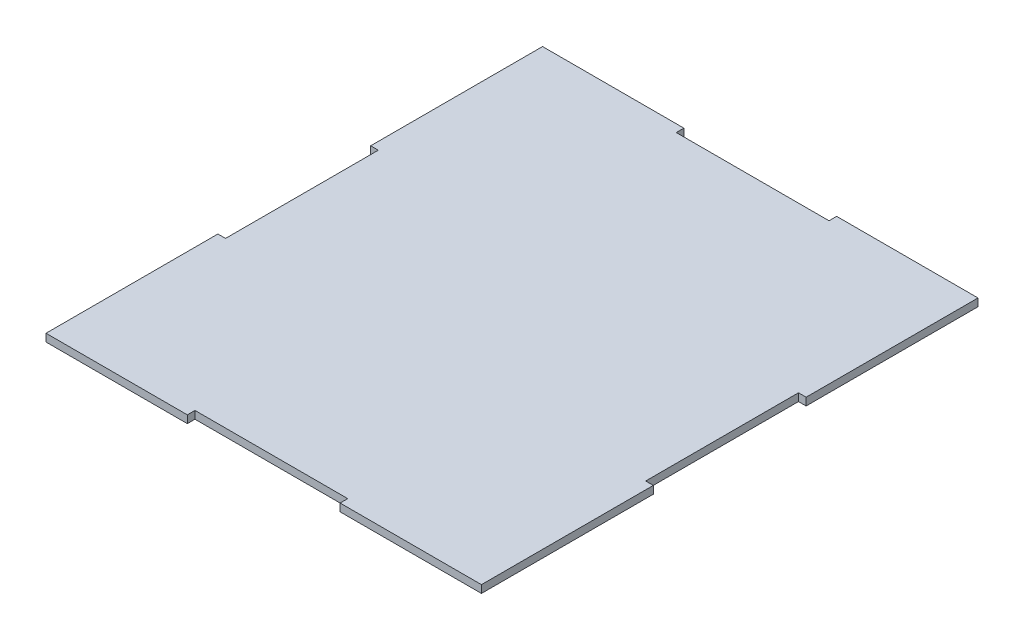
ISO-10303-21;
HEADER;
FILE_DESCRIPTION(('STEP AP214'),'2;1');
FILE_NAME('part.step','',(''),(''),'','','');
FILE_SCHEMA(('AUTOMOTIVE_DESIGN { 1 0 10303 214 1 1 1 1 }'));
ENDSEC;
DATA;
#1=APPLICATION_CONTEXT('core data for automotive mechanical design processes');
#2=APPLICATION_PROTOCOL_DEFINITION('international standard','automotive_design',2000,#1);
#3=PRODUCT_CONTEXT('',#1,'mechanical');
#4=PRODUCT('Part','Part','',(#3));
#5=PRODUCT_RELATED_PRODUCT_CATEGORY('part','',(#4));
#6=PRODUCT_DEFINITION_FORMATION('','',#4);
#7=PRODUCT_DEFINITION_CONTEXT('part definition',#1,'design');
#8=PRODUCT_DEFINITION('design','',#6,#7);
#9=PRODUCT_DEFINITION_SHAPE('','',#8);
#10=(LENGTH_UNIT() NAMED_UNIT(*) SI_UNIT(.MILLI.,.METRE.));
#11=(NAMED_UNIT(*) PLANE_ANGLE_UNIT() SI_UNIT($,.RADIAN.));
#12=(NAMED_UNIT(*) SI_UNIT($,.STERADIAN.) SOLID_ANGLE_UNIT());
#13=UNCERTAINTY_MEASURE_WITH_UNIT(LENGTH_MEASURE(1.E-05),#10,'distance_accuracy_value','');
#14=(GEOMETRIC_REPRESENTATION_CONTEXT(3) GLOBAL_UNCERTAINTY_ASSIGNED_CONTEXT((#13)) GLOBAL_UNIT_ASSIGNED_CONTEXT((#10,
#11,#12)) REPRESENTATION_CONTEXT('',''));
#15=CARTESIAN_POINT('',(0.,0.,0.));
#16=DIRECTION('',(0.,0.,1.));
#17=DIRECTION('',(1.,0.,0.));
#18=AXIS2_PLACEMENT_3D('',#15,#16,#17);
#19=CARTESIAN_POINT('',(0.,5.,0.));
#20=DIRECTION('',(1.,0.,0.));
#21=DIRECTION('',(0.,0.,-1.));
#22=AXIS2_PLACEMENT_3D('',#19,#20,#21);
#23=PLANE('',#22);
#24=DIRECTION('',(0.,0.,1.));
#25=VECTOR('',#24,1.);
#26=CARTESIAN_POINT('',(0.,0.,0.));
#27=LINE('',#26,#25);
#28=CARTESIAN_POINT('',(0.,0.,-325.));
#29=VERTEX_POINT('',#28);
#30=CARTESIAN_POINT('',(0.,0.,-212.5));
#31=VERTEX_POINT('',#30);
#32=EDGE_CURVE('E299',#29,#31,#27,.T.);
#33=ORIENTED_EDGE('',*,*,#32,.T.);
#34=DIRECTION('',(0.,1.,0.));
#35=VECTOR('',#34,1.);
#36=CARTESIAN_POINT('',(0.,0.,-212.5));
#37=LINE('',#36,#35);
#38=CARTESIAN_POINT('',(0.,5.,-212.5));
#39=VERTEX_POINT('',#38);
#40=EDGE_CURVE('E215',#31,#39,#37,.T.);
#41=ORIENTED_EDGE('',*,*,#40,.T.);
#42=DIRECTION('',(0.,0.,1.));
#43=VECTOR('',#42,1.);
#44=CARTESIAN_POINT('',(0.,5.,0.));
#45=LINE('',#44,#43);
#46=CARTESIAN_POINT('',(0.,5.,-325.));
#47=VERTEX_POINT('',#46);
#48=EDGE_CURVE('E282',#47,#39,#45,.T.);
#49=ORIENTED_EDGE('',*,*,#48,.F.);
#50=DIRECTION('',(0.,-1.,0.));
#51=VECTOR('',#50,1.);
#52=CARTESIAN_POINT('',(0.,5.,-325.));
#53=LINE('',#52,#51);
#54=EDGE_CURVE('E298',#47,#29,#53,.T.);
#55=ORIENTED_EDGE('',*,*,#54,.T.);
#56=EDGE_LOOP('',(#33,#41,#49,#55));
#57=FACE_BOUND('',#56,.T.);
#58=ADVANCED_FACE('F33',(#57),#23,.F.);
#59=CARTESIAN_POINT('',(0.,5.,0.));
#60=DIRECTION('',(0.,0.,-1.));
#61=DIRECTION('',(-1.,0.,0.));
#62=AXIS2_PLACEMENT_3D('',#59,#60,#61);
#63=PLANE('',#62);
#64=DIRECTION('',(1.,0.,0.));
#65=VECTOR('',#64,1.);
#66=CARTESIAN_POINT('',(0.,0.,0.));
#67=LINE('',#66,#65);
#68=CARTESIAN_POINT('',(0.,0.,0.));
#69=VERTEX_POINT('',#68);
#70=CARTESIAN_POINT('',(92.5,0.,0.));
#71=VERTEX_POINT('',#70);
#72=EDGE_CURVE('E303',#69,#71,#67,.T.);
#73=ORIENTED_EDGE('',*,*,#72,.T.);
#74=DIRECTION('',(0.,1.,0.));
#75=VECTOR('',#74,1.);
#76=CARTESIAN_POINT('',(92.5,0.,0.));
#77=LINE('',#76,#75);
#78=CARTESIAN_POINT('',(92.5,5.,0.));
#79=VERTEX_POINT('',#78);
#80=EDGE_CURVE('E246',#71,#79,#77,.T.);
#81=ORIENTED_EDGE('',*,*,#80,.T.);
#82=DIRECTION('',(1.,0.,0.));
#83=VECTOR('',#82,1.);
#84=CARTESIAN_POINT('',(0.,5.,0.));
#85=LINE('',#84,#83);
#86=CARTESIAN_POINT('',(0.,5.,0.));
#87=VERTEX_POINT('',#86);
#88=EDGE_CURVE('E287',#87,#79,#85,.T.);
#89=ORIENTED_EDGE('',*,*,#88,.F.);
#90=DIRECTION('',(0.,-1.,0.));
#91=VECTOR('',#90,1.);
#92=CARTESIAN_POINT('',(0.,5.,0.));
#93=LINE('',#92,#91);
#94=EDGE_CURVE('E11',#87,#69,#93,.T.);
#95=ORIENTED_EDGE('',*,*,#94,.T.);
#96=EDGE_LOOP('',(#73,#81,#89,#95));
#97=FACE_BOUND('',#96,.T.);
#98=ADVANCED_FACE('F349',(#97),#63,.F.);
#99=CARTESIAN_POINT('',(285.,5.,0.));
#100=DIRECTION('',(-1.,0.,0.));
#101=DIRECTION('',(0.,0.,1.));
#102=AXIS2_PLACEMENT_3D('',#99,#100,#101);
#103=PLANE('',#102);
#104=DIRECTION('',(0.,0.,-1.));
#105=VECTOR('',#104,1.);
#106=CARTESIAN_POINT('',(285.,0.,0.));
#107=LINE('',#106,#105);
#108=CARTESIAN_POINT('',(285.,0.,0.));
#109=VERTEX_POINT('',#108);
#110=CARTESIAN_POINT('',(285.,0.,-112.5));
#111=VERTEX_POINT('',#110);
#112=EDGE_CURVE('E307',#109,#111,#107,.T.);
#113=ORIENTED_EDGE('',*,*,#112,.T.);
#114=DIRECTION('',(0.,1.,0.));
#115=VECTOR('',#114,1.);
#116=CARTESIAN_POINT('',(285.,0.,-112.5));
#117=LINE('',#116,#115);
#118=CARTESIAN_POINT('',(285.,5.,-112.5));
#119=VERTEX_POINT('',#118);
#120=EDGE_CURVE('E219',#111,#119,#117,.T.);
#121=ORIENTED_EDGE('',*,*,#120,.T.);
#122=DIRECTION('',(0.,0.,-1.));
#123=VECTOR('',#122,1.);
#124=CARTESIAN_POINT('',(285.,5.,0.));
#125=LINE('',#124,#123);
#126=CARTESIAN_POINT('',(285.,5.,0.));
#127=VERTEX_POINT('',#126);
#128=EDGE_CURVE('E291',#127,#119,#125,.T.);
#129=ORIENTED_EDGE('',*,*,#128,.F.);
#130=DIRECTION('',(0.,-1.,0.));
#131=VECTOR('',#130,1.);
#132=CARTESIAN_POINT('',(285.,5.,0.));
#133=LINE('',#132,#131);
#134=EDGE_CURVE('E41',#127,#109,#133,.T.);
#135=ORIENTED_EDGE('',*,*,#134,.T.);
#136=EDGE_LOOP('',(#113,#121,#129,#135));
#137=FACE_BOUND('',#136,.T.);
#138=ADVANCED_FACE('F322',(#137),#103,.F.);
#139=CARTESIAN_POINT('',(0.,5.,-325.));
#140=DIRECTION('',(0.,0.,1.));
#141=DIRECTION('',(1.,0.,0.));
#142=AXIS2_PLACEMENT_3D('',#139,#140,#141);
#143=PLANE('',#142);
#144=DIRECTION('',(-1.,0.,0.));
#145=VECTOR('',#144,1.);
#146=CARTESIAN_POINT('',(0.,5.,-325.));
#147=LINE('',#146,#145);
#148=CARTESIAN_POINT('',(92.5,5.,-325.));
#149=VERTEX_POINT('',#148);
#150=EDGE_CURVE('E294',#149,#47,#147,.T.);
#151=ORIENTED_EDGE('',*,*,#150,.F.);
#152=DIRECTION('',(0.,1.,0.));
#153=VECTOR('',#152,1.);
#154=CARTESIAN_POINT('',(92.5,0.,-325.));
#155=LINE('',#154,#153);
#156=CARTESIAN_POINT('',(92.5,0.,-325.));
#157=VERTEX_POINT('',#156);
#158=EDGE_CURVE('E200',#157,#149,#155,.T.);
#159=ORIENTED_EDGE('',*,*,#158,.F.);
#160=DIRECTION('',(-1.,0.,0.));
#161=VECTOR('',#160,1.);
#162=CARTESIAN_POINT('',(0.,0.,-325.));
#163=LINE('',#162,#161);
#164=EDGE_CURVE('E190',#157,#29,#163,.T.);
#165=ORIENTED_EDGE('',*,*,#164,.T.);
#166=ORIENTED_EDGE('',*,*,#54,.F.);
#167=EDGE_LOOP('',(#151,#159,#165,#166));
#168=FACE_BOUND('',#167,.T.);
#169=ADVANCED_FACE('F369',(#168),#143,.F.);
#170=CARTESIAN_POINT('',(0.,5.,-112.5));
#171=VERTEX_POINT('',#170);
#172=EDGE_CURVE('E286',#171,#87,#45,.T.);
#173=ORIENTED_EDGE('',*,*,#172,.F.);
#174=DIRECTION('',(0.,1.,0.));
#175=VECTOR('',#174,1.);
#176=CARTESIAN_POINT('',(0.,0.,-112.5));
#177=LINE('',#176,#175);
#178=CARTESIAN_POINT('',(0.,0.,-112.5));
#179=VERTEX_POINT('',#178);
#180=EDGE_CURVE('E227',#179,#171,#177,.T.);
#181=ORIENTED_EDGE('',*,*,#180,.F.);
#182=EDGE_CURVE('E202',#179,#69,#27,.T.);
#183=ORIENTED_EDGE('',*,*,#182,.T.);
#184=ORIENTED_EDGE('',*,*,#94,.F.);
#185=EDGE_LOOP('',(#173,#181,#183,#184));
#186=FACE_BOUND('',#185,.T.);
#187=ADVANCED_FACE('F35',(#186),#23,.F.);
#188=CARTESIAN_POINT('',(192.5,5.,0.));
#189=VERTEX_POINT('',#188);
#190=EDGE_CURVE('E285',#189,#127,#85,.T.);
#191=ORIENTED_EDGE('',*,*,#190,.F.);
#192=DIRECTION('',(0.,1.,0.));
#193=VECTOR('',#192,1.);
#194=CARTESIAN_POINT('',(192.5,0.,0.));
#195=LINE('',#194,#193);
#196=CARTESIAN_POINT('',(192.5,0.,0.));
#197=VERTEX_POINT('',#196);
#198=EDGE_CURVE('E267',#197,#189,#195,.T.);
#199=ORIENTED_EDGE('',*,*,#198,.F.);
#200=EDGE_CURVE('E302',#197,#109,#67,.T.);
#201=ORIENTED_EDGE('',*,*,#200,.T.);
#202=ORIENTED_EDGE('',*,*,#134,.F.);
#203=EDGE_LOOP('',(#191,#199,#201,#202));
#204=FACE_BOUND('',#203,.T.);
#205=ADVANCED_FACE('F336',(#204),#63,.F.);
#206=CARTESIAN_POINT('',(285.,5.,-212.5));
#207=VERTEX_POINT('',#206);
#208=CARTESIAN_POINT('',(285.,5.,-325.));
#209=VERTEX_POINT('',#208);
#210=EDGE_CURVE('E290',#207,#209,#125,.T.);
#211=ORIENTED_EDGE('',*,*,#210,.F.);
#212=DIRECTION('',(0.,1.,0.));
#213=VECTOR('',#212,1.);
#214=CARTESIAN_POINT('',(285.,0.,-212.5));
#215=LINE('',#214,#213);
#216=CARTESIAN_POINT('',(285.,0.,-212.5));
#217=VERTEX_POINT('',#216);
#218=EDGE_CURVE('E241',#217,#207,#215,.T.);
#219=ORIENTED_EDGE('',*,*,#218,.F.);
#220=CARTESIAN_POINT('',(285.,0.,-325.));
#221=VERTEX_POINT('',#220);
#222=EDGE_CURVE('E306',#217,#221,#107,.T.);
#223=ORIENTED_EDGE('',*,*,#222,.T.);
#224=DIRECTION('',(0.,-1.,0.));
#225=VECTOR('',#224,1.);
#226=CARTESIAN_POINT('',(285.,5.,-325.));
#227=LINE('',#226,#225);
#228=EDGE_CURVE('E315',#209,#221,#227,.T.);
#229=ORIENTED_EDGE('',*,*,#228,.F.);
#230=EDGE_LOOP('',(#211,#219,#223,#229));
#231=FACE_BOUND('',#230,.T.);
#232=ADVANCED_FACE('F381',(#231),#103,.F.);
#233=CARTESIAN_POINT('',(192.5,0.,-325.));
#234=VERTEX_POINT('',#233);
#235=EDGE_CURVE('E310',#221,#234,#163,.T.);
#236=ORIENTED_EDGE('',*,*,#235,.T.);
#237=DIRECTION('',(0.,1.,0.));
#238=VECTOR('',#237,1.);
#239=CARTESIAN_POINT('',(192.5,0.,-325.));
#240=LINE('',#239,#238);
#241=CARTESIAN_POINT('',(192.5,5.,-325.));
#242=VERTEX_POINT('',#241);
#243=EDGE_CURVE('E203',#234,#242,#240,.T.);
#244=ORIENTED_EDGE('',*,*,#243,.T.);
#245=EDGE_CURVE('E295',#209,#242,#147,.T.);
#246=ORIENTED_EDGE('',*,*,#245,.F.);
#247=ORIENTED_EDGE('',*,*,#228,.T.);
#248=EDGE_LOOP('',(#236,#244,#246,#247));
#249=FACE_BOUND('',#248,.T.);
#250=ADVANCED_FACE('F374',(#249),#143,.F.);
#251=CARTESIAN_POINT('',(0.,5.,0.));
#252=DIRECTION('',(0.,-1.,0.));
#253=DIRECTION('',(0.,0.,-1.));
#254=AXIS2_PLACEMENT_3D('',#251,#252,#253);
#255=PLANE('',#254);
#256=DIRECTION('',(1.,0.,0.));
#257=VECTOR('',#256,1.);
#258=CARTESIAN_POINT('',(92.5,5.,-320.));
#259=LINE('',#258,#257);
#260=CARTESIAN_POINT('',(92.5,5.,-320.));
#261=VERTEX_POINT('',#260);
#262=CARTESIAN_POINT('',(192.5,5.,-320.));
#263=VERTEX_POINT('',#262);
#264=EDGE_CURVE('E193',#261,#263,#259,.T.);
#265=ORIENTED_EDGE('',*,*,#264,.F.);
#266=DIRECTION('',(0.,0.,1.));
#267=VECTOR('',#266,1.);
#268=CARTESIAN_POINT('',(92.5,5.,-325.));
#269=LINE('',#268,#267);
#270=EDGE_CURVE('E176',#149,#261,#269,.T.);
#271=ORIENTED_EDGE('',*,*,#270,.F.);
#272=ORIENTED_EDGE('',*,*,#150,.T.);
#273=ORIENTED_EDGE('',*,*,#48,.T.);
#274=DIRECTION('',(-1.,0.,0.));
#275=VECTOR('',#274,1.);
#276=CARTESIAN_POINT('',(0.,5.,-212.5));
#277=LINE('',#276,#275);
#278=CARTESIAN_POINT('',(5.,5.,-212.5));
#279=VERTEX_POINT('',#278);
#280=EDGE_CURVE('E216',#279,#39,#277,.T.);
#281=ORIENTED_EDGE('',*,*,#280,.F.);
#282=DIRECTION('',(0.,0.,-1.));
#283=VECTOR('',#282,1.);
#284=CARTESIAN_POINT('',(5.,5.,-212.5));
#285=LINE('',#284,#283);
#286=CARTESIAN_POINT('',(5.00000000000001,5.,-112.5));
#287=VERTEX_POINT('',#286);
#288=EDGE_CURVE('E211',#287,#279,#285,.T.);
#289=ORIENTED_EDGE('',*,*,#288,.F.);
#290=DIRECTION('',(1.,0.,0.));
#291=VECTOR('',#290,1.);
#292=CARTESIAN_POINT('',(0.,5.,-112.5));
#293=LINE('',#292,#291);
#294=EDGE_CURVE('E218',#171,#287,#293,.T.);
#295=ORIENTED_EDGE('',*,*,#294,.F.);
#296=ORIENTED_EDGE('',*,*,#172,.T.);
#297=ORIENTED_EDGE('',*,*,#88,.T.);
#298=DIRECTION('',(0.,0.,1.));
#299=VECTOR('',#298,1.);
#300=CARTESIAN_POINT('',(92.5,5.,0.));
#301=LINE('',#300,#299);
#302=CARTESIAN_POINT('',(92.5000000000001,5.,-5.00000000000006));
#303=VERTEX_POINT('',#302);
#304=EDGE_CURVE('E261',#303,#79,#301,.T.);
#305=ORIENTED_EDGE('',*,*,#304,.F.);
#306=DIRECTION('',(-1.,0.,0.));
#307=VECTOR('',#306,1.);
#308=CARTESIAN_POINT('',(92.5000000000001,5.,-5.00000000000006));
#309=LINE('',#308,#307);
#310=CARTESIAN_POINT('',(192.5,5.,-5.00000000000006));
#311=VERTEX_POINT('',#310);
#312=EDGE_CURVE('E271',#311,#303,#309,.T.);
#313=ORIENTED_EDGE('',*,*,#312,.F.);
#314=DIRECTION('',(0.,0.,-1.));
#315=VECTOR('',#314,1.);
#316=CARTESIAN_POINT('',(192.5,5.,0.));
#317=LINE('',#316,#315);
#318=EDGE_CURVE('E268',#189,#311,#317,.T.);
#319=ORIENTED_EDGE('',*,*,#318,.F.);
#320=ORIENTED_EDGE('',*,*,#190,.T.);
#321=ORIENTED_EDGE('',*,*,#128,.T.);
#322=DIRECTION('',(1.,0.,0.));
#323=VECTOR('',#322,1.);
#324=CARTESIAN_POINT('',(285.,5.,-112.5));
#325=LINE('',#324,#323);
#326=CARTESIAN_POINT('',(280.,5.,-112.5));
#327=VERTEX_POINT('',#326);
#328=EDGE_CURVE('E235',#327,#119,#325,.T.);
#329=ORIENTED_EDGE('',*,*,#328,.F.);
#330=DIRECTION('',(0.,0.,1.));
#331=VECTOR('',#330,1.);
#332=CARTESIAN_POINT('',(280.,5.,-212.5));
#333=LINE('',#332,#331);
#334=CARTESIAN_POINT('',(280.,5.,-212.5));
#335=VERTEX_POINT('',#334);
#336=EDGE_CURVE('E245',#335,#327,#333,.T.);
#337=ORIENTED_EDGE('',*,*,#336,.F.);
#338=DIRECTION('',(-1.,0.,0.));
#339=VECTOR('',#338,1.);
#340=CARTESIAN_POINT('',(285.,5.,-212.5));
#341=LINE('',#340,#339);
#342=EDGE_CURVE('E242',#207,#335,#341,.T.);
#343=ORIENTED_EDGE('',*,*,#342,.F.);
#344=ORIENTED_EDGE('',*,*,#210,.T.);
#345=ORIENTED_EDGE('',*,*,#245,.T.);
#346=DIRECTION('',(0.,0.,-1.));
#347=VECTOR('',#346,1.);
#348=CARTESIAN_POINT('',(192.5,5.,-325.));
#349=LINE('',#348,#347);
#350=EDGE_CURVE('E191',#263,#242,#349,.T.);
#351=ORIENTED_EDGE('',*,*,#350,.F.);
#352=EDGE_LOOP('',(#265,#271,#272,#273,#281,#289,#295,#296,#297,#305,#313,#319,#320,#321,#329,
#337,#343,#344,#345,#351));
#353=FACE_BOUND('',#352,.T.);
#354=ADVANCED_FACE('F331',(#353),#255,.F.);
#355=CARTESIAN_POINT('',(0.,0.,0.));
#356=DIRECTION('',(0.,-1.,0.));
#357=DIRECTION('',(0.,0.,-1.));
#358=AXIS2_PLACEMENT_3D('',#355,#356,#357);
#359=PLANE('',#358);
#360=DIRECTION('',(0.,0.,1.));
#361=VECTOR('',#360,1.);
#362=CARTESIAN_POINT('',(92.5,0.,-325.));
#363=LINE('',#362,#361);
#364=CARTESIAN_POINT('',(92.5,0.,-320.));
#365=VERTEX_POINT('',#364);
#366=EDGE_CURVE('E173',#157,#365,#363,.T.);
#367=ORIENTED_EDGE('',*,*,#366,.T.);
#368=DIRECTION('',(1.,0.,0.));
#369=VECTOR('',#368,1.);
#370=CARTESIAN_POINT('',(92.5,0.,-320.));
#371=LINE('',#370,#369);
#372=CARTESIAN_POINT('',(192.5,0.,-320.));
#373=VERTEX_POINT('',#372);
#374=EDGE_CURVE('E183',#365,#373,#371,.T.);
#375=ORIENTED_EDGE('',*,*,#374,.T.);
#376=DIRECTION('',(0.,0.,-1.));
#377=VECTOR('',#376,1.);
#378=CARTESIAN_POINT('',(192.5,0.,-325.));
#379=LINE('',#378,#377);
#380=EDGE_CURVE('E48',#373,#234,#379,.T.);
#381=ORIENTED_EDGE('',*,*,#380,.T.);
#382=ORIENTED_EDGE('',*,*,#235,.F.);
#383=ORIENTED_EDGE('',*,*,#222,.F.);
#384=DIRECTION('',(-1.,0.,0.));
#385=VECTOR('',#384,1.);
#386=CARTESIAN_POINT('',(285.,0.,-212.5));
#387=LINE('',#386,#385);
#388=CARTESIAN_POINT('',(280.,0.,-212.5));
#389=VERTEX_POINT('',#388);
#390=EDGE_CURVE('E231',#217,#389,#387,.T.);
#391=ORIENTED_EDGE('',*,*,#390,.T.);
#392=DIRECTION('',(0.,0.,1.));
#393=VECTOR('',#392,1.);
#394=CARTESIAN_POINT('',(280.,0.,-212.5));
#395=LINE('',#394,#393);
#396=CARTESIAN_POINT('',(280.,0.,-112.5));
#397=VERTEX_POINT('',#396);
#398=EDGE_CURVE('E234',#389,#397,#395,.T.);
#399=ORIENTED_EDGE('',*,*,#398,.T.);
#400=DIRECTION('',(1.,0.,0.));
#401=VECTOR('',#400,1.);
#402=CARTESIAN_POINT('',(285.,0.,-112.5));
#403=LINE('',#402,#401);
#404=EDGE_CURVE('E238',#397,#111,#403,.T.);
#405=ORIENTED_EDGE('',*,*,#404,.T.);
#406=ORIENTED_EDGE('',*,*,#112,.F.);
#407=ORIENTED_EDGE('',*,*,#200,.F.);
#408=DIRECTION('',(0.,0.,-1.));
#409=VECTOR('',#408,1.);
#410=CARTESIAN_POINT('',(192.5,0.,0.));
#411=LINE('',#410,#409);
#412=CARTESIAN_POINT('',(192.5,0.,-5.00000000000006));
#413=VERTEX_POINT('',#412);
#414=EDGE_CURVE('E257',#197,#413,#411,.T.);
#415=ORIENTED_EDGE('',*,*,#414,.T.);
#416=DIRECTION('',(-1.,0.,0.));
#417=VECTOR('',#416,1.);
#418=CARTESIAN_POINT('',(92.5000000000001,0.,-5.00000000000006));
#419=LINE('',#418,#417);
#420=CARTESIAN_POINT('',(92.5000000000001,0.,-5.00000000000006));
#421=VERTEX_POINT('',#420);
#422=EDGE_CURVE('E260',#413,#421,#419,.T.);
#423=ORIENTED_EDGE('',*,*,#422,.T.);
#424=DIRECTION('',(0.,0.,1.));
#425=VECTOR('',#424,1.);
#426=CARTESIAN_POINT('',(92.5,0.,0.));
#427=LINE('',#426,#425);
#428=EDGE_CURVE('E264',#421,#71,#427,.T.);
#429=ORIENTED_EDGE('',*,*,#428,.T.);
#430=ORIENTED_EDGE('',*,*,#72,.F.);
#431=ORIENTED_EDGE('',*,*,#182,.F.);
#432=DIRECTION('',(1.,0.,0.));
#433=VECTOR('',#432,1.);
#434=CARTESIAN_POINT('',(0.,0.,-112.5));
#435=LINE('',#434,#433);
#436=CARTESIAN_POINT('',(5.00000000000001,0.,-112.5));
#437=VERTEX_POINT('',#436);
#438=EDGE_CURVE('E210',#179,#437,#435,.T.);
#439=ORIENTED_EDGE('',*,*,#438,.T.);
#440=DIRECTION('',(0.,0.,-1.));
#441=VECTOR('',#440,1.);
#442=CARTESIAN_POINT('',(5.,0.,-212.5));
#443=LINE('',#442,#441);
#444=CARTESIAN_POINT('',(5.,0.,-212.5));
#445=VERTEX_POINT('',#444);
#446=EDGE_CURVE('E56',#437,#445,#443,.T.);
#447=ORIENTED_EDGE('',*,*,#446,.T.);
#448=DIRECTION('',(-1.,0.,0.));
#449=VECTOR('',#448,1.);
#450=CARTESIAN_POINT('',(0.,0.,-212.5));
#451=LINE('',#450,#449);
#452=EDGE_CURVE('E207',#445,#31,#451,.T.);
#453=ORIENTED_EDGE('',*,*,#452,.T.);
#454=ORIENTED_EDGE('',*,*,#32,.F.);
#455=ORIENTED_EDGE('',*,*,#164,.F.);
#456=EDGE_LOOP('',(#367,#375,#381,#382,#383,#391,#399,#405,#406,#407,#415,#423,#429,#430,#431,
#439,#447,#453,#454,#455));
#457=FACE_BOUND('',#456,.T.);
#458=ADVANCED_FACE('F188',(#457),#359,.T.);
#459=CARTESIAN_POINT('',(92.5,0.,0.));
#460=DIRECTION('',(-1.,0.,0.));
#461=DIRECTION('',(0.,0.,1.));
#462=AXIS2_PLACEMENT_3D('',#459,#460,#461);
#463=PLANE('',#462);
#464=ORIENTED_EDGE('',*,*,#304,.T.);
#465=ORIENTED_EDGE('',*,*,#80,.F.);
#466=ORIENTED_EDGE('',*,*,#428,.F.);
#467=DIRECTION('',(0.,1.,0.));
#468=VECTOR('',#467,1.);
#469=CARTESIAN_POINT('',(92.5000000000001,0.,-5.00000000000006));
#470=LINE('',#469,#468);
#471=EDGE_CURVE('E277',#421,#303,#470,.T.);
#472=ORIENTED_EDGE('',*,*,#471,.T.);
#473=EDGE_LOOP('',(#464,#465,#466,#472));
#474=FACE_BOUND('',#473,.T.);
#475=ADVANCED_FACE('F346',(#474),#463,.F.);
#476=CARTESIAN_POINT('',(92.5000000000001,0.,-5.00000000000006));
#477=DIRECTION('',(0.,0.,-1.));
#478=DIRECTION('',(-1.,0.,0.));
#479=AXIS2_PLACEMENT_3D('',#476,#477,#478);
#480=PLANE('',#479);
#481=ORIENTED_EDGE('',*,*,#312,.T.);
#482=ORIENTED_EDGE('',*,*,#471,.F.);
#483=ORIENTED_EDGE('',*,*,#422,.F.);
#484=DIRECTION('',(0.,1.,0.));
#485=VECTOR('',#484,1.);
#486=CARTESIAN_POINT('',(192.5,0.,-5.00000000000006));
#487=LINE('',#486,#485);
#488=EDGE_CURVE('E279',#413,#311,#487,.T.);
#489=ORIENTED_EDGE('',*,*,#488,.T.);
#490=EDGE_LOOP('',(#481,#482,#483,#489));
#491=FACE_BOUND('',#490,.T.);
#492=ADVANCED_FACE('F343',(#491),#480,.F.);
#493=CARTESIAN_POINT('',(192.5,0.,0.));
#494=DIRECTION('',(1.,0.,0.));
#495=DIRECTION('',(0.,0.,-1.));
#496=AXIS2_PLACEMENT_3D('',#493,#494,#495);
#497=PLANE('',#496);
#498=ORIENTED_EDGE('',*,*,#318,.T.);
#499=ORIENTED_EDGE('',*,*,#488,.F.);
#500=ORIENTED_EDGE('',*,*,#414,.F.);
#501=ORIENTED_EDGE('',*,*,#198,.T.);
#502=EDGE_LOOP('',(#498,#499,#500,#501));
#503=FACE_BOUND('',#502,.T.);
#504=ADVANCED_FACE('F338',(#503),#497,.F.);
#505=CARTESIAN_POINT('',(285.,0.,-112.5));
#506=DIRECTION('',(0.,0.,1.));
#507=DIRECTION('',(1.,0.,0.));
#508=AXIS2_PLACEMENT_3D('',#505,#506,#507);
#509=PLANE('',#508);
#510=ORIENTED_EDGE('',*,*,#328,.T.);
#511=ORIENTED_EDGE('',*,*,#120,.F.);
#512=ORIENTED_EDGE('',*,*,#404,.F.);
#513=DIRECTION('',(0.,1.,0.));
#514=VECTOR('',#513,1.);
#515=CARTESIAN_POINT('',(280.,0.,-112.5));
#516=LINE('',#515,#514);
#517=EDGE_CURVE('E252',#397,#327,#516,.T.);
#518=ORIENTED_EDGE('',*,*,#517,.T.);
#519=EDGE_LOOP('',(#510,#511,#512,#518));
#520=FACE_BOUND('',#519,.T.);
#521=ADVANCED_FACE('F328',(#520),#509,.F.);
#522=CARTESIAN_POINT('',(280.,0.,-212.5));
#523=DIRECTION('',(-1.,0.,0.));
#524=DIRECTION('',(0.,0.,1.));
#525=AXIS2_PLACEMENT_3D('',#522,#523,#524);
#526=PLANE('',#525);
#527=ORIENTED_EDGE('',*,*,#336,.T.);
#528=ORIENTED_EDGE('',*,*,#517,.F.);
#529=ORIENTED_EDGE('',*,*,#398,.F.);
#530=DIRECTION('',(0.,1.,0.));
#531=VECTOR('',#530,1.);
#532=CARTESIAN_POINT('',(280.,0.,-212.5));
#533=LINE('',#532,#531);
#534=EDGE_CURVE('E254',#389,#335,#533,.T.);
#535=ORIENTED_EDGE('',*,*,#534,.T.);
#536=EDGE_LOOP('',(#527,#528,#529,#535));
#537=FACE_BOUND('',#536,.T.);
#538=ADVANCED_FACE('F387',(#537),#526,.F.);
#539=CARTESIAN_POINT('',(285.,0.,-212.5));
#540=DIRECTION('',(0.,0.,-1.));
#541=DIRECTION('',(-1.,0.,0.));
#542=AXIS2_PLACEMENT_3D('',#539,#540,#541);
#543=PLANE('',#542);
#544=ORIENTED_EDGE('',*,*,#342,.T.);
#545=ORIENTED_EDGE('',*,*,#534,.F.);
#546=ORIENTED_EDGE('',*,*,#390,.F.);
#547=ORIENTED_EDGE('',*,*,#218,.T.);
#548=EDGE_LOOP('',(#544,#545,#546,#547));
#549=FACE_BOUND('',#548,.T.);
#550=ADVANCED_FACE('F384',(#549),#543,.F.);
#551=CARTESIAN_POINT('',(0.,0.,-212.5));
#552=DIRECTION('',(0.,0.,-1.));
#553=DIRECTION('',(-1.,0.,0.));
#554=AXIS2_PLACEMENT_3D('',#551,#552,#553);
#555=PLANE('',#554);
#556=ORIENTED_EDGE('',*,*,#280,.T.);
#557=ORIENTED_EDGE('',*,*,#40,.F.);
#558=ORIENTED_EDGE('',*,*,#452,.F.);
#559=DIRECTION('',(0.,1.,0.));
#560=VECTOR('',#559,1.);
#561=CARTESIAN_POINT('',(5.,0.,-212.5));
#562=LINE('',#561,#560);
#563=EDGE_CURVE('E198',#445,#279,#562,.T.);
#564=ORIENTED_EDGE('',*,*,#563,.T.);
#565=EDGE_LOOP('',(#556,#557,#558,#564));
#566=FACE_BOUND('',#565,.T.);
#567=ADVANCED_FACE('F364',(#566),#555,.F.);
#568=CARTESIAN_POINT('',(5.,0.,-212.5));
#569=DIRECTION('',(1.,0.,0.));
#570=DIRECTION('',(0.,0.,-1.));
#571=AXIS2_PLACEMENT_3D('',#568,#569,#570);
#572=PLANE('',#571);
#573=ORIENTED_EDGE('',*,*,#288,.T.);
#574=ORIENTED_EDGE('',*,*,#563,.F.);
#575=ORIENTED_EDGE('',*,*,#446,.F.);
#576=DIRECTION('',(0.,1.,0.));
#577=VECTOR('',#576,1.);
#578=CARTESIAN_POINT('',(5.00000000000001,0.,-112.5));
#579=LINE('',#578,#577);
#580=EDGE_CURVE('E225',#437,#287,#579,.T.);
#581=ORIENTED_EDGE('',*,*,#580,.T.);
#582=EDGE_LOOP('',(#573,#574,#575,#581));
#583=FACE_BOUND('',#582,.T.);
#584=ADVANCED_FACE('F359',(#583),#572,.F.);
#585=CARTESIAN_POINT('',(0.,0.,-112.5));
#586=DIRECTION('',(0.,0.,1.));
#587=DIRECTION('',(1.,0.,0.));
#588=AXIS2_PLACEMENT_3D('',#585,#586,#587);
#589=PLANE('',#588);
#590=ORIENTED_EDGE('',*,*,#294,.T.);
#591=ORIENTED_EDGE('',*,*,#580,.F.);
#592=ORIENTED_EDGE('',*,*,#438,.F.);
#593=ORIENTED_EDGE('',*,*,#180,.T.);
#594=EDGE_LOOP('',(#590,#591,#592,#593));
#595=FACE_BOUND('',#594,.T.);
#596=ADVANCED_FACE('F358',(#595),#589,.F.);
#597=CARTESIAN_POINT('',(92.5,0.,-325.));
#598=DIRECTION('',(-1.,0.,0.));
#599=DIRECTION('',(0.,0.,1.));
#600=AXIS2_PLACEMENT_3D('',#597,#598,#599);
#601=PLANE('',#600);
#602=ORIENTED_EDGE('',*,*,#270,.T.);
#603=DIRECTION('',(0.,1.,0.));
#604=VECTOR('',#603,1.);
#605=CARTESIAN_POINT('',(92.5,0.,-320.));
#606=LINE('',#605,#604);
#607=EDGE_CURVE('E169',#365,#261,#606,.T.);
#608=ORIENTED_EDGE('',*,*,#607,.F.);
#609=ORIENTED_EDGE('',*,*,#366,.F.);
#610=ORIENTED_EDGE('',*,*,#158,.T.);
#611=EDGE_LOOP('',(#602,#608,#609,#610));
#612=FACE_BOUND('',#611,.T.);
#613=ADVANCED_FACE('F171',(#612),#601,.F.);
#614=CARTESIAN_POINT('',(192.5,0.,-325.));
#615=DIRECTION('',(1.,0.,0.));
#616=DIRECTION('',(0.,0.,-1.));
#617=AXIS2_PLACEMENT_3D('',#614,#615,#616);
#618=PLANE('',#617);
#619=ORIENTED_EDGE('',*,*,#350,.T.);
#620=ORIENTED_EDGE('',*,*,#243,.F.);
#621=ORIENTED_EDGE('',*,*,#380,.F.);
#622=DIRECTION('',(0.,1.,0.));
#623=VECTOR('',#622,1.);
#624=CARTESIAN_POINT('',(192.5,0.,-320.));
#625=LINE('',#624,#623);
#626=EDGE_CURVE('E180',#373,#263,#625,.T.);
#627=ORIENTED_EDGE('',*,*,#626,.T.);
#628=EDGE_LOOP('',(#619,#620,#621,#627));
#629=FACE_BOUND('',#628,.T.);
#630=ADVANCED_FACE('F372',(#629),#618,.F.);
#631=CARTESIAN_POINT('',(92.5,0.,-320.));
#632=DIRECTION('',(0.,0.,1.));
#633=DIRECTION('',(1.,0.,0.));
#634=AXIS2_PLACEMENT_3D('',#631,#632,#633);
#635=PLANE('',#634);
#636=ORIENTED_EDGE('',*,*,#264,.T.);
#637=ORIENTED_EDGE('',*,*,#626,.F.);
#638=ORIENTED_EDGE('',*,*,#374,.F.);
#639=ORIENTED_EDGE('',*,*,#607,.T.);
#640=EDGE_LOOP('',(#636,#637,#638,#639));
#641=FACE_BOUND('',#640,.T.);
#642=ADVANCED_FACE('F184',(#641),#635,.F.);
#643=CLOSED_SHELL('',(#58,#98,#138,#169,#187,#205,#232,#250,#354,#458,#475,#492,#504,#521,#538,
#550,#567,#584,#596,#613,#630,#642));
#644=MANIFOLD_SOLID_BREP('B2',#643);
#645=ADVANCED_BREP_SHAPE_REPRESENTATION('',(#18,#644),#14);
#646=SHAPE_DEFINITION_REPRESENTATION(#9,#645);
ENDSEC;
END-ISO-10303-21;
